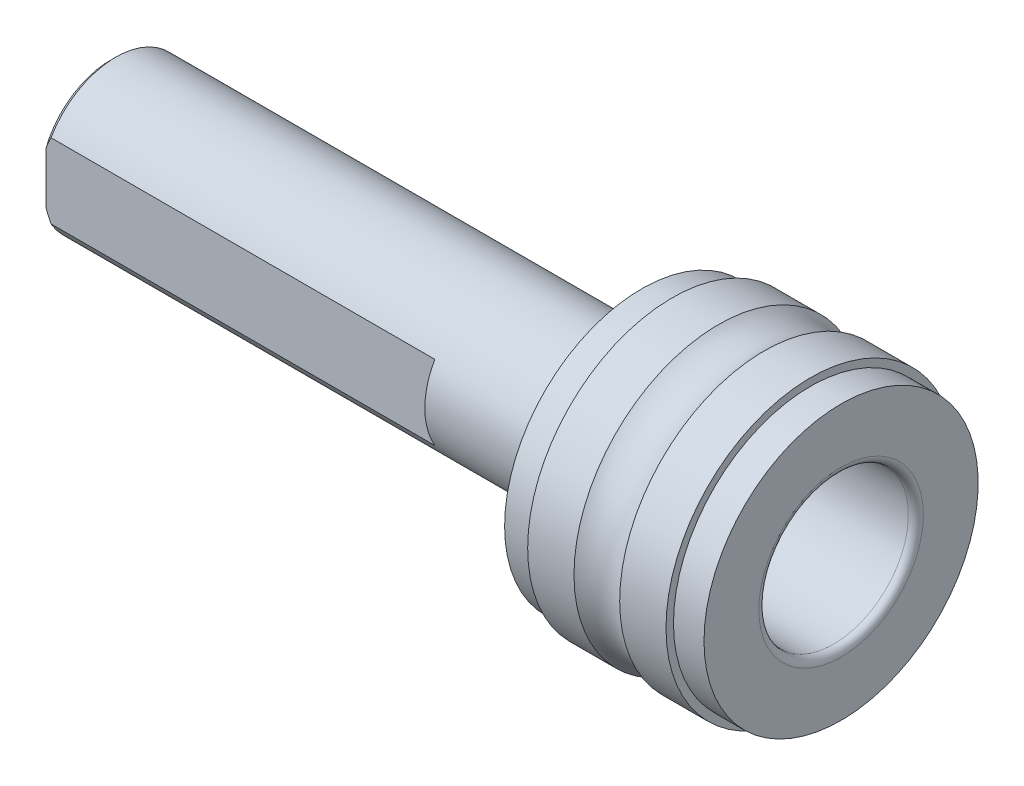
ISO-10303-21;
HEADER;
FILE_DESCRIPTION(('STEP AP214'),'2;1');
FILE_NAME('part.step','',(''),(''),'','','');
FILE_SCHEMA(('AUTOMOTIVE_DESIGN { 1 0 10303 214 1 1 1 1 }'));
ENDSEC;
DATA;
#1=APPLICATION_CONTEXT('core data for automotive mechanical design processes');
#2=APPLICATION_PROTOCOL_DEFINITION('international standard','automotive_design',2000,#1);
#3=PRODUCT_CONTEXT('',#1,'mechanical');
#4=PRODUCT('Part','Part','',(#3));
#5=PRODUCT_RELATED_PRODUCT_CATEGORY('part','',(#4));
#6=PRODUCT_DEFINITION_FORMATION('','',#4);
#7=PRODUCT_DEFINITION_CONTEXT('part definition',#1,'design');
#8=PRODUCT_DEFINITION('design','',#6,#7);
#9=PRODUCT_DEFINITION_SHAPE('','',#8);
#10=(LENGTH_UNIT() NAMED_UNIT(*) SI_UNIT(.MILLI.,.METRE.));
#11=(NAMED_UNIT(*) PLANE_ANGLE_UNIT() SI_UNIT($,.RADIAN.));
#12=(NAMED_UNIT(*) SI_UNIT($,.STERADIAN.) SOLID_ANGLE_UNIT());
#13=UNCERTAINTY_MEASURE_WITH_UNIT(LENGTH_MEASURE(1.E-05),#10,'distance_accuracy_value','');
#14=(GEOMETRIC_REPRESENTATION_CONTEXT(3) GLOBAL_UNCERTAINTY_ASSIGNED_CONTEXT((#13)) GLOBAL_UNIT_ASSIGNED_CONTEXT((#10,
#11,#12)) REPRESENTATION_CONTEXT('',''));
#15=CARTESIAN_POINT('',(0.,0.,0.));
#16=DIRECTION('',(0.,0.,1.));
#17=DIRECTION('',(1.,0.,0.));
#18=AXIS2_PLACEMENT_3D('',#15,#16,#17);
#19=CARTESIAN_POINT('',(0.,0.75,0.));
#20=DIRECTION('',(1.,0.,0.));
#21=DIRECTION('',(0.,0.,-1.));
#22=AXIS2_PLACEMENT_3D('',#19,#20,#21);
#23=PLANE('',#22);
#24=CARTESIAN_POINT('',(0.,0.,0.));
#25=DIRECTION('',(-1.,0.,0.));
#26=DIRECTION('',(0.,0.,1.));
#27=AXIS2_PLACEMENT_3D('',#24,#25,#26);
#28=CIRCLE('',#27,1.5);
#29=CARTESIAN_POINT('',(0.,0.,1.5));
#30=VERTEX_POINT('',#29);
#31=EDGE_CURVE('E176',#30,#30,#28,.F.);
#32=ORIENTED_EDGE('',*,*,#31,.T.);
#33=EDGE_LOOP('',(#32));
#34=FACE_BOUND('',#33,.T.);
#35=ADVANCED_FACE('F16',(#34),#23,.T.);
#36=CARTESIAN_POINT('',(0.899999999999999,0.,0.));
#37=DIRECTION('',(-1.,0.,0.));
#38=DIRECTION('',(0.,0.,1.));
#39=AXIS2_PLACEMENT_3D('',#36,#37,#38);
#40=CYLINDRICAL_SURFACE('',#39,1.5);
#41=ORIENTED_EDGE('',*,*,#31,.F.);
#42=EDGE_LOOP('',(#41));
#43=FACE_BOUND('',#42,.T.);
#44=CARTESIAN_POINT('',(2.75,0.,0.));
#45=DIRECTION('',(1.,0.,0.));
#46=DIRECTION('',(0.,0.,1.));
#47=AXIS2_PLACEMENT_3D('',#44,#45,#46);
#48=CIRCLE('',#47,1.5);
#49=CARTESIAN_POINT('',(2.75,0.,1.5));
#50=VERTEX_POINT('',#49);
#51=EDGE_CURVE('E168',#50,#50,#48,.F.);
#52=ORIENTED_EDGE('',*,*,#51,.F.);
#53=EDGE_LOOP('',(#52));
#54=FACE_BOUND('',#53,.T.);
#55=ADVANCED_FACE('F365',(#43,#54),#40,.F.);
#56=CARTESIAN_POINT('',(2.75,0.,0.));
#57=DIRECTION('',(1.,0.,0.));
#58=DIRECTION('',(0.,0.,1.));
#59=AXIS2_PLACEMENT_3D('',#56,#57,#58);
#60=TOROIDAL_SURFACE('',#59,1.65,0.149999999999999);
#61=CARTESIAN_POINT('',(2.9,0.,0.));
#62=DIRECTION('',(1.,0.,0.));
#63=DIRECTION('',(0.,0.,-1.));
#64=AXIS2_PLACEMENT_3D('',#61,#62,#63);
#65=CIRCLE('',#64,1.65);
#66=CARTESIAN_POINT('',(2.9,0.,1.65));
#67=VERTEX_POINT('',#66);
#68=CARTESIAN_POINT('',(2.9,0.,-1.65));
#69=VERTEX_POINT('',#68);
#70=EDGE_CURVE('E132',#67,#69,#65,.F.);
#71=ORIENTED_EDGE('',*,*,#70,.F.);
#72=CARTESIAN_POINT('',(2.9,0.,0.));
#73=DIRECTION('',(1.,0.,0.));
#74=DIRECTION('',(0.,0.,1.));
#75=AXIS2_PLACEMENT_3D('',#72,#73,#74);
#76=CIRCLE('',#75,1.65);
#77=EDGE_CURVE('E164',#69,#67,#76,.F.);
#78=ORIENTED_EDGE('',*,*,#77,.F.);
#79=EDGE_LOOP('',(#71,#78));
#80=FACE_BOUND('',#79,.T.);
#81=ORIENTED_EDGE('',*,*,#51,.T.);
#82=EDGE_LOOP('',(#81));
#83=FACE_BOUND('',#82,.T.);
#84=ADVANCED_FACE('F148',(#80,#83),#60,.T.);
#85=CARTESIAN_POINT('',(2.9,0.,-2.2));
#86=DIRECTION('',(1.,0.,0.));
#87=DIRECTION('',(0.,0.,-1.));
#88=AXIS2_PLACEMENT_3D('',#85,#86,#87);
#89=PLANE('',#88);
#90=CARTESIAN_POINT('',(2.9,0.,0.));
#91=DIRECTION('',(-1.,0.,0.));
#92=DIRECTION('',(0.,0.,1.));
#93=AXIS2_PLACEMENT_3D('',#90,#91,#92);
#94=CIRCLE('',#93,2.75);
#95=CARTESIAN_POINT('',(2.9,0.,2.75));
#96=VERTEX_POINT('',#95);
#97=EDGE_CURVE('E505',#96,#96,#94,.T.);
#98=ORIENTED_EDGE('',*,*,#97,.F.);
#99=EDGE_LOOP('',(#98));
#100=FACE_BOUND('',#99,.T.);
#101=ORIENTED_EDGE('',*,*,#70,.T.);
#102=ORIENTED_EDGE('',*,*,#77,.T.);
#103=EDGE_LOOP('',(#101,#102));
#104=FACE_BOUND('',#103,.T.);
#105=ADVANCED_FACE('F138',(#100,#104),#89,.T.);
#106=CARTESIAN_POINT('',(2.59375,0.,0.));
#107=DIRECTION('',(-1.,0.,0.));
#108=DIRECTION('',(0.,0.,1.));
#109=AXIS2_PLACEMENT_3D('',#106,#107,#108);
#110=CYLINDRICAL_SURFACE('',#109,2.75);
#111=ORIENTED_EDGE('',*,*,#97,.T.);
#112=EDGE_LOOP('',(#111));
#113=FACE_BOUND('',#112,.T.);
#114=CARTESIAN_POINT('',(2.2875,0.,0.));
#115=DIRECTION('',(-1.,0.,0.));
#116=DIRECTION('',(0.,0.,1.));
#117=AXIS2_PLACEMENT_3D('',#114,#115,#116);
#118=CIRCLE('',#117,2.75);
#119=CARTESIAN_POINT('',(2.2875,0.,2.75));
#120=VERTEX_POINT('',#119);
#121=EDGE_CURVE('E508',#120,#120,#118,.T.);
#122=ORIENTED_EDGE('',*,*,#121,.F.);
#123=EDGE_LOOP('',(#122));
#124=FACE_BOUND('',#123,.T.);
#125=ADVANCED_FACE('F147',(#113,#124),#110,.T.);
#126=CARTESIAN_POINT('',(2.2875,0.,-2.825));
#127=DIRECTION('',(1.,0.,0.));
#128=DIRECTION('',(0.,0.,-1.));
#129=AXIS2_PLACEMENT_3D('',#126,#127,#128);
#130=PLANE('',#129);
#131=CARTESIAN_POINT('',(2.2875,0.,0.));
#132=DIRECTION('',(-1.,0.,0.));
#133=DIRECTION('',(0.,0.,1.));
#134=AXIS2_PLACEMENT_3D('',#131,#132,#133);
#135=CIRCLE('',#134,2.9);
#136=CARTESIAN_POINT('',(2.2875,0.,2.9));
#137=VERTEX_POINT('',#136);
#138=EDGE_CURVE('E127',#137,#137,#135,.T.);
#139=ORIENTED_EDGE('',*,*,#138,.F.);
#140=EDGE_LOOP('',(#139));
#141=FACE_BOUND('',#140,.T.);
#142=ORIENTED_EDGE('',*,*,#121,.T.);
#143=EDGE_LOOP('',(#142));
#144=FACE_BOUND('',#143,.T.);
#145=ADVANCED_FACE('F326',(#141,#144),#130,.T.);
#146=CARTESIAN_POINT('',(1.82287878474779,0.,0.));
#147=DIRECTION('',(-1.,0.,0.));
#148=DIRECTION('',(0.,0.,1.));
#149=AXIS2_PLACEMENT_3D('',#146,#147,#148);
#150=CYLINDRICAL_SURFACE('',#149,2.9);
#151=ORIENTED_EDGE('',*,*,#138,.T.);
#152=EDGE_LOOP('',(#151));
#153=FACE_BOUND('',#152,.T.);
#154=CARTESIAN_POINT('',(1.35825756949558,0.,0.));
#155=DIRECTION('',(1.,0.,0.));
#156=DIRECTION('',(0.,0.,1.));
#157=AXIS2_PLACEMENT_3D('',#154,#155,#156);
#158=CIRCLE('',#157,2.9);
#159=CARTESIAN_POINT('',(1.35825756949558,0.,2.9));
#160=VERTEX_POINT('',#159);
#161=EDGE_CURVE('E124',#160,#160,#158,.T.);
#162=ORIENTED_EDGE('',*,*,#161,.T.);
#163=EDGE_LOOP('',(#162));
#164=FACE_BOUND('',#163,.T.);
#165=ADVANCED_FACE('F116',(#153,#164),#150,.T.);
#166=CARTESIAN_POINT('',(0.899999999999999,0.,0.));
#167=DIRECTION('',(1.,0.,0.));
#168=DIRECTION('',(0.,0.,1.));
#169=AXIS2_PLACEMENT_3D('',#166,#167,#168);
#170=TOROIDAL_SURFACE('',#169,3.525,0.775000000000002);
#171=ORIENTED_EDGE('',*,*,#161,.F.);
#172=EDGE_LOOP('',(#171));
#173=FACE_BOUND('',#172,.T.);
#174=CARTESIAN_POINT('',(0.441742430504415,0.,0.));
#175=DIRECTION('',(-1.,0.,0.));
#176=DIRECTION('',(0.,0.,1.));
#177=AXIS2_PLACEMENT_3D('',#174,#175,#176);
#178=CIRCLE('',#177,2.9);
#179=CARTESIAN_POINT('',(0.441742430504415,0.,2.9));
#180=VERTEX_POINT('',#179);
#181=EDGE_CURVE('E122',#180,#180,#178,.T.);
#182=ORIENTED_EDGE('',*,*,#181,.F.);
#183=EDGE_LOOP('',(#182));
#184=FACE_BOUND('',#183,.T.);
#185=ADVANCED_FACE('F111',(#173,#184),#170,.F.);
#186=CARTESIAN_POINT('',(-0.0228787847477929,0.,0.));
#187=DIRECTION('',(-1.,0.,0.));
#188=DIRECTION('',(0.,0.,1.));
#189=AXIS2_PLACEMENT_3D('',#186,#187,#188);
#190=CYLINDRICAL_SURFACE('',#189,2.9);
#191=ORIENTED_EDGE('',*,*,#181,.T.);
#192=EDGE_LOOP('',(#191));
#193=FACE_BOUND('',#192,.T.);
#194=CARTESIAN_POINT('',(-0.487500000000001,0.,0.));
#195=DIRECTION('',(-1.,0.,0.));
#196=DIRECTION('',(0.,0.,1.));
#197=AXIS2_PLACEMENT_3D('',#194,#195,#196);
#198=CIRCLE('',#197,2.9);
#199=CARTESIAN_POINT('',(-0.487500000000001,0.,2.9));
#200=VERTEX_POINT('',#199);
#201=EDGE_CURVE('E513',#200,#200,#198,.T.);
#202=ORIENTED_EDGE('',*,*,#201,.F.);
#203=EDGE_LOOP('',(#202));
#204=FACE_BOUND('',#203,.T.);
#205=ADVANCED_FACE('F107',(#193,#204),#190,.T.);
#206=CARTESIAN_POINT('',(-0.487500000000001,0.,-2.825));
#207=DIRECTION('',(-1.,0.,0.));
#208=DIRECTION('',(0.,0.,1.));
#209=AXIS2_PLACEMENT_3D('',#206,#207,#208);
#210=PLANE('',#209);
#211=CARTESIAN_POINT('',(-0.487500000000001,0.,0.));
#212=DIRECTION('',(-1.,0.,0.));
#213=DIRECTION('',(0.,0.,1.));
#214=AXIS2_PLACEMENT_3D('',#211,#212,#213);
#215=CIRCLE('',#214,2.75);
#216=CARTESIAN_POINT('',(-0.487500000000001,0.,2.75));
#217=VERTEX_POINT('',#216);
#218=EDGE_CURVE('E516',#217,#217,#215,.T.);
#219=ORIENTED_EDGE('',*,*,#218,.F.);
#220=EDGE_LOOP('',(#219));
#221=FACE_BOUND('',#220,.T.);
#222=ORIENTED_EDGE('',*,*,#201,.T.);
#223=EDGE_LOOP('',(#222));
#224=FACE_BOUND('',#223,.T.);
#225=ADVANCED_FACE('F103',(#221,#224),#210,.T.);
#226=CARTESIAN_POINT('',(-0.793750000000001,0.,0.));
#227=DIRECTION('',(-1.,0.,0.));
#228=DIRECTION('',(0.,0.,1.));
#229=AXIS2_PLACEMENT_3D('',#226,#227,#228);
#230=CYLINDRICAL_SURFACE('',#229,2.75);
#231=ORIENTED_EDGE('',*,*,#218,.T.);
#232=EDGE_LOOP('',(#231));
#233=FACE_BOUND('',#232,.T.);
#234=CARTESIAN_POINT('',(-1.1,0.,0.));
#235=DIRECTION('',(-1.,0.,0.));
#236=DIRECTION('',(0.,0.,1.));
#237=AXIS2_PLACEMENT_3D('',#234,#235,#236);
#238=CIRCLE('',#237,2.75);
#239=CARTESIAN_POINT('',(-1.1,0.,2.75));
#240=VERTEX_POINT('',#239);
#241=EDGE_CURVE('E518',#240,#240,#238,.T.);
#242=ORIENTED_EDGE('',*,*,#241,.F.);
#243=EDGE_LOOP('',(#242));
#244=FACE_BOUND('',#243,.T.);
#245=ADVANCED_FACE('F98',(#233,#244),#230,.T.);
#246=CARTESIAN_POINT('',(-1.1,0.,-2.2));
#247=DIRECTION('',(-1.,0.,0.));
#248=DIRECTION('',(0.,0.,1.));
#249=AXIS2_PLACEMENT_3D('',#246,#247,#248);
#250=PLANE('',#249);
#251=CARTESIAN_POINT('',(-1.1,0.,0.));
#252=DIRECTION('',(-1.,0.,0.));
#253=DIRECTION('',(0.,0.,1.));
#254=AXIS2_PLACEMENT_3D('',#251,#252,#253);
#255=CIRCLE('',#254,1.65);
#256=CARTESIAN_POINT('',(-1.1,0.,1.65));
#257=VERTEX_POINT('',#256);
#258=CARTESIAN_POINT('',(-1.1,0.,-1.65));
#259=VERTEX_POINT('',#258);
#260=EDGE_CURVE('E65',#257,#259,#255,.T.);
#261=ORIENTED_EDGE('',*,*,#260,.F.);
#262=CARTESIAN_POINT('',(-1.1,0.,0.));
#263=DIRECTION('',(-1.,0.,0.));
#264=DIRECTION('',(0.,0.,-1.));
#265=AXIS2_PLACEMENT_3D('',#262,#263,#264);
#266=CIRCLE('',#265,1.65);
#267=EDGE_CURVE('E69',#259,#257,#266,.T.);
#268=ORIENTED_EDGE('',*,*,#267,.F.);
#269=EDGE_LOOP('',(#261,#268));
#270=FACE_BOUND('',#269,.T.);
#271=ORIENTED_EDGE('',*,*,#241,.T.);
#272=EDGE_LOOP('',(#271));
#273=FACE_BOUND('',#272,.T.);
#274=ADVANCED_FACE('F77',(#270,#273),#250,.T.);
#275=CARTESIAN_POINT('',(-3.95,1.5,1.5));
#276=DIRECTION('',(1.,0.,0.));
#277=DIRECTION('',(0.,0.,-1.));
#278=AXIS2_PLACEMENT_3D('',#275,#276,#277);
#279=PLANE('',#278);
#280=DIRECTION('',(0.,1.,0.));
#281=VECTOR('',#280,1.);
#282=CARTESIAN_POINT('',(-3.95,1.5,1.3));
#283=LINE('',#282,#281);
#284=CARTESIAN_POINT('',(-3.95,0.748331477354788,1.3));
#285=VERTEX_POINT('',#284);
#286=CARTESIAN_POINT('',(-3.95,-0.748331477354788,1.3));
#287=VERTEX_POINT('',#286);
#288=EDGE_CURVE('E191',#285,#287,#283,.F.);
#289=ORIENTED_EDGE('',*,*,#288,.T.);
#290=CARTESIAN_POINT('',(-3.95,0.,0.));
#291=DIRECTION('',(-1.,0.,0.));
#292=DIRECTION('',(0.,0.,1.));
#293=AXIS2_PLACEMENT_3D('',#290,#291,#292);
#294=CIRCLE('',#293,1.5);
#295=EDGE_CURVE('E181',#285,#287,#294,.F.);
#296=ORIENTED_EDGE('',*,*,#295,.F.);
#297=EDGE_LOOP('',(#289,#296));
#298=FACE_BOUND('',#297,.T.);
#299=ADVANCED_FACE('F97',(#298),#279,.F.);
#300=CARTESIAN_POINT('',(-3.95,1.5,1.3));
#301=DIRECTION('',(0.,0.,-1.));
#302=DIRECTION('',(-1.,0.,0.));
#303=AXIS2_PLACEMENT_3D('',#300,#301,#302);
#304=PLANE('',#303);
#305=DIRECTION('',(-1.,0.,0.));
#306=VECTOR('',#305,1.);
#307=CARTESIAN_POINT('',(-5.875,-0.748331477354789,1.3));
#308=LINE('',#307,#306);
#309=CARTESIAN_POINT('',(-11.6500000000162,-0.748331477349861,1.3));
#310=VERTEX_POINT('',#309);
#311=EDGE_CURVE('E180',#287,#310,#308,.T.);
#312=ORIENTED_EDGE('',*,*,#311,.F.);
#313=ORIENTED_EDGE('',*,*,#288,.F.);
#314=DIRECTION('',(-1.,0.,0.));
#315=VECTOR('',#314,1.);
#316=CARTESIAN_POINT('',(-5.875,0.748331477354789,1.3));
#317=LINE('',#316,#315);
#318=CARTESIAN_POINT('',(-11.6500000000162,0.748331477349861,1.3));
#319=VERTEX_POINT('',#318);
#320=EDGE_CURVE('E79',#319,#285,#317,.F.);
#321=ORIENTED_EDGE('',*,*,#320,.F.);
#322=CARTESIAN_POINT('',(-11.7499999999973,0.519615242259964,1.29999999999442));
#323=CARTESIAN_POINT('',(-11.7427547242464,0.539135120223893,1.29999999999799));
#324=CARTESIAN_POINT('',(-11.7352013244939,0.558538916484224,1.29999999999946));
#325=CARTESIAN_POINT('',(-11.7195374537166,0.597104377334995,1.30000000000054));
#326=CARTESIAN_POINT('',(-11.7114273866139,0.616266205792126,1.30000000000016));
#327=CARTESIAN_POINT('',(-11.6946994741092,0.654364246453664,1.29999999999985));
#328=CARTESIAN_POINT('',(-11.6860816697854,0.673300476761448,1.29999999999992));
#329=CARTESIAN_POINT('',(-11.6683785480491,0.71096994862772,1.30000000000008));
#330=CARTESIAN_POINT('',(-11.6592928991896,0.729703034569403,1.30000000000016));
#331=CARTESIAN_POINT('',(-11.650000000001,0.748331477344841,1.3));
#332=B_SPLINE_CURVE_WITH_KNOTS('',3,(#322,#323,#324,#325,#326,#327,#328,#329,#330,#331),
.UNSPECIFIED.,.F.,.F.,(4,2,2,2,4),(0.,0.0624584960326132,0.12487214124644,0.187280743806504,
0.249734185241162),.UNSPECIFIED.);
#333=CARTESIAN_POINT('',(-11.7500000000314,0.519615242175211,1.3));
#334=VERTEX_POINT('',#333);
#335=EDGE_CURVE('E39',#334,#319,#332,.T.);
#336=ORIENTED_EDGE('',*,*,#335,.F.);
#337=DIRECTION('',(0.,1.,0.));
#338=VECTOR('',#337,1.);
#339=CARTESIAN_POINT('',(-11.75,0.75,1.3));
#340=LINE('',#339,#338);
#341=CARTESIAN_POINT('',(-11.7500000000314,-0.519615242175211,1.3));
#342=VERTEX_POINT('',#341);
#343=EDGE_CURVE('E73',#342,#334,#340,.T.);
#344=ORIENTED_EDGE('',*,*,#343,.F.);
#345=CARTESIAN_POINT('',(-11.6500000000001,-0.748331477344505,1.29999999999804));
#346=CARTESIAN_POINT('',(-11.6592928991892,-0.729703034569313,1.29999999999929));
#347=CARTESIAN_POINT('',(-11.6683785480489,-0.710969948627756,1.29999999999981));
#348=CARTESIAN_POINT('',(-11.6860816697855,-0.673300476761591,1.30000000000019));
#349=CARTESIAN_POINT('',(-11.6946994741092,-0.654364246453787,1.30000000000005));
#350=CARTESIAN_POINT('',(-11.7114273866138,-0.61626620579219,1.29999999999995));
#351=CARTESIAN_POINT('',(-11.7195374537163,-0.597104377335019,1.29999999999997));
#352=CARTESIAN_POINT('',(-11.7352013244941,-0.558538916484484,1.30000000000003));
#353=CARTESIAN_POINT('',(-11.7427547242472,-0.539135120224429,1.30000000000005));
#354=CARTESIAN_POINT('',(-11.7499999999995,-0.519615242261103,1.3));
#355=B_SPLINE_CURVE_WITH_KNOTS('',3,(#345,#346,#347,#348,#349,#350,#351,#352,#353,#354),
.UNSPECIFIED.,.F.,.F.,(4,2,2,2,4),(0.,0.0624534414346474,0.124862043994724,0.187275689208492,
0.24973418524102),.UNSPECIFIED.);
#356=EDGE_CURVE('E184',#310,#342,#355,.T.);
#357=ORIENTED_EDGE('',*,*,#356,.F.);
#358=EDGE_LOOP('',(#312,#313,#321,#336,#344,#357));
#359=FACE_BOUND('',#358,.T.);
#360=ADVANCED_FACE('F196',(#359),#304,.F.);
#361=CARTESIAN_POINT('',(-11.75,0.75,0.));
#362=DIRECTION('',(-1.,0.,0.));
#363=DIRECTION('',(0.,0.,1.));
#364=AXIS2_PLACEMENT_3D('',#361,#362,#363);
#365=PLANE('',#364);
#366=CARTESIAN_POINT('',(-11.7500000000632,0.,0.));
#367=DIRECTION('',(1.,0.,0.));
#368=DIRECTION('',(0.,0.,-1.));
#369=AXIS2_PLACEMENT_3D('',#366,#367,#368);
#370=CIRCLE('',#369,1.39999999993279);
#371=EDGE_CURVE('E177',#342,#334,#370,.T.);
#372=ORIENTED_EDGE('',*,*,#371,.F.);
#373=ORIENTED_EDGE('',*,*,#343,.T.);
#374=EDGE_LOOP('',(#372,#373));
#375=FACE_BOUND('',#374,.T.);
#376=ADVANCED_FACE('F210',(#375),#365,.T.);
#377=CARTESIAN_POINT('',(-0.950000000000001,0.,0.));
#378=DIRECTION('',(1.,0.,0.));
#379=DIRECTION('',(0.,0.,1.));
#380=AXIS2_PLACEMENT_3D('',#377,#378,#379);
#381=TOROIDAL_SURFACE('',#380,1.65,0.15);
#382=CARTESIAN_POINT('',(-0.950000000000001,0.,0.));
#383=DIRECTION('',(-1.,0.,0.));
#384=DIRECTION('',(0.,0.,1.));
#385=AXIS2_PLACEMENT_3D('',#382,#383,#384);
#386=CIRCLE('',#385,1.5);
#387=CARTESIAN_POINT('',(-0.950000000000001,0.,1.5));
#388=VERTEX_POINT('',#387);
#389=EDGE_CURVE('E26',#388,#388,#386,.T.);
#390=ORIENTED_EDGE('',*,*,#389,.F.);
#391=EDGE_LOOP('',(#390));
#392=FACE_BOUND('',#391,.T.);
#393=ORIENTED_EDGE('',*,*,#267,.T.);
#394=ORIENTED_EDGE('',*,*,#260,.T.);
#395=EDGE_LOOP('',(#393,#394));
#396=FACE_BOUND('',#395,.T.);
#397=ADVANCED_FACE('F68',(#392,#396),#381,.T.);
#398=CARTESIAN_POINT('',(-11.6500000000883,0.,0.));
#399=DIRECTION('',(1.,0.,0.));
#400=DIRECTION('',(0.,0.,-1.));
#401=AXIS2_PLACEMENT_3D('',#398,#399,#400);
#402=CONICAL_SURFACE('',#401,1.49999999990769,0.785398163397448);
#403=ORIENTED_EDGE('',*,*,#335,.T.);
#404=CARTESIAN_POINT('',(-11.65,0.,0.));
#405=DIRECTION('',(-1.,0.,0.));
#406=DIRECTION('',(0.,0.,1.));
#407=AXIS2_PLACEMENT_3D('',#404,#405,#406);
#408=CIRCLE('',#407,1.5);
#409=EDGE_CURVE('E11',#310,#319,#408,.F.);
#410=ORIENTED_EDGE('',*,*,#409,.F.);
#411=ORIENTED_EDGE('',*,*,#356,.T.);
#412=ORIENTED_EDGE('',*,*,#371,.T.);
#413=EDGE_LOOP('',(#403,#410,#411,#412));
#414=FACE_BOUND('',#413,.T.);
#415=ADVANCED_FACE('F199',(#414),#402,.T.);
#416=CARTESIAN_POINT('',(-5.875,0.,0.));
#417=DIRECTION('',(-1.,0.,0.));
#418=DIRECTION('',(0.,0.,1.));
#419=AXIS2_PLACEMENT_3D('',#416,#417,#418);
#420=CYLINDRICAL_SURFACE('',#419,1.5);
#421=ORIENTED_EDGE('',*,*,#389,.T.);
#422=EDGE_LOOP('',(#421));
#423=FACE_BOUND('',#422,.T.);
#424=ORIENTED_EDGE('',*,*,#409,.T.);
#425=ORIENTED_EDGE('',*,*,#320,.T.);
#426=ORIENTED_EDGE('',*,*,#295,.T.);
#427=ORIENTED_EDGE('',*,*,#311,.T.);
#428=EDGE_LOOP('',(#424,#425,#426,#427));
#429=FACE_BOUND('',#428,.T.);
#430=ADVANCED_FACE('F204',(#423,#429),#420,.T.);
#431=CLOSED_SHELL('',(#35,#55,#84,#105,#125,#145,#165,#185,#205,#225,#245,#274,#299,#360,#376,
#397,#415,#430));
#432=MANIFOLD_SOLID_BREP('B1',#431);
#433=ADVANCED_BREP_SHAPE_REPRESENTATION('',(#18,#432),#14);
#434=SHAPE_DEFINITION_REPRESENTATION(#9,#433);
ENDSEC;
END-ISO-10303-21;
